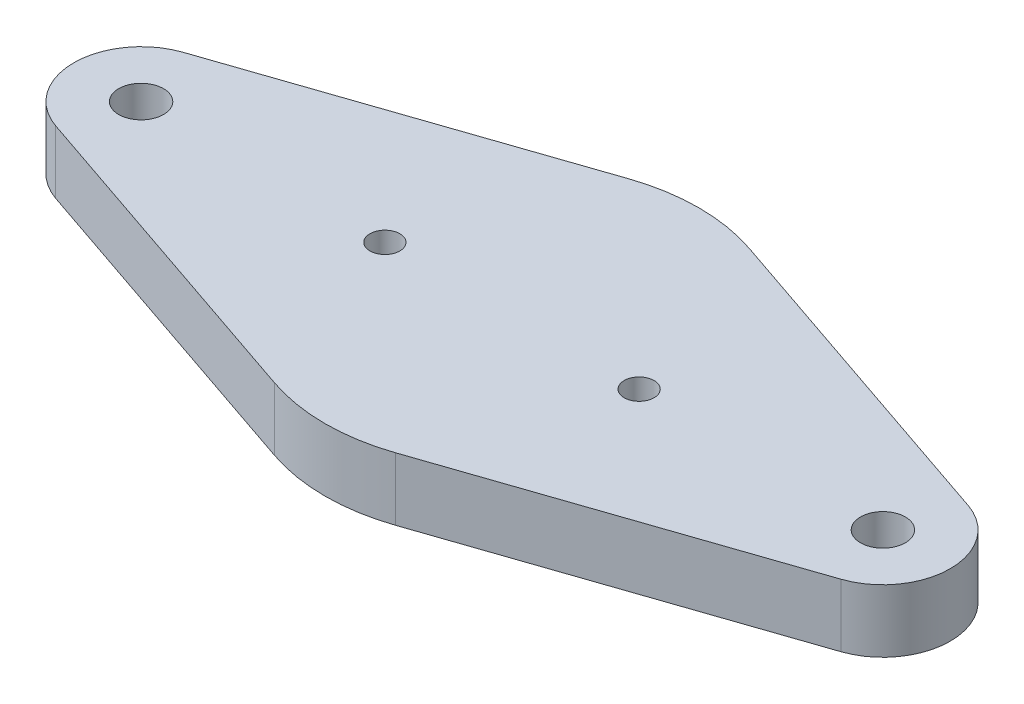
ISO-10303-21;
HEADER;
FILE_DESCRIPTION(('STEP AP214'),'2;1');
FILE_NAME('part.step','',(''),(''),'','','');
FILE_SCHEMA(('AUTOMOTIVE_DESIGN { 1 0 10303 214 1 1 1 1 }'));
ENDSEC;
DATA;
#1=APPLICATION_CONTEXT('core data for automotive mechanical design processes');
#2=APPLICATION_PROTOCOL_DEFINITION('international standard','automotive_design',2000,#1);
#3=PRODUCT_CONTEXT('',#1,'mechanical');
#4=PRODUCT('Part','Part','',(#3));
#5=PRODUCT_RELATED_PRODUCT_CATEGORY('part','',(#4));
#6=PRODUCT_DEFINITION_FORMATION('','',#4);
#7=PRODUCT_DEFINITION_CONTEXT('part definition',#1,'design');
#8=PRODUCT_DEFINITION('design','',#6,#7);
#9=PRODUCT_DEFINITION_SHAPE('','',#8);
#10=(LENGTH_UNIT() NAMED_UNIT(*) SI_UNIT(.MILLI.,.METRE.));
#11=(NAMED_UNIT(*) PLANE_ANGLE_UNIT() SI_UNIT($,.RADIAN.));
#12=(NAMED_UNIT(*) SI_UNIT($,.STERADIAN.) SOLID_ANGLE_UNIT());
#13=UNCERTAINTY_MEASURE_WITH_UNIT(LENGTH_MEASURE(1.E-05),#10,'distance_accuracy_value','');
#14=(GEOMETRIC_REPRESENTATION_CONTEXT(3) GLOBAL_UNCERTAINTY_ASSIGNED_CONTEXT((#13)) GLOBAL_UNIT_ASSIGNED_CONTEXT((#10,
#11,#12)) REPRESENTATION_CONTEXT('',''));
#15=CARTESIAN_POINT('',(0.,0.,0.));
#16=DIRECTION('',(0.,0.,1.));
#17=DIRECTION('',(1.,0.,0.));
#18=AXIS2_PLACEMENT_3D('',#15,#16,#17);
#19=CARTESIAN_POINT('',(24.8,4.2,0.));
#20=DIRECTION('',(0.,1.,0.));
#21=DIRECTION('',(0.,0.,1.));
#22=AXIS2_PLACEMENT_3D('',#19,#20,#21);
#23=PLANE('',#22);
#24=CARTESIAN_POINT('',(8.5,4.2,0.));
#25=DIRECTION('',(0.,1.,0.));
#26=DIRECTION('',(0.,0.,1.));
#27=AXIS2_PLACEMENT_3D('',#24,#25,#26);
#28=CIRCLE('',#27,1.);
#29=CARTESIAN_POINT('',(8.5,4.2,1.));
#30=VERTEX_POINT('',#29);
#31=EDGE_CURVE('E192',#30,#30,#28,.T.);
#32=ORIENTED_EDGE('',*,*,#31,.F.);
#33=EDGE_LOOP('',(#32));
#34=FACE_BOUND('',#33,.T.);
#35=CARTESIAN_POINT('',(24.8,4.2,0.));
#36=DIRECTION('',(0.,1.,0.));
#37=DIRECTION('',(0.,0.,1.));
#38=AXIS2_PLACEMENT_3D('',#35,#36,#37);
#39=CIRCLE('',#38,1.5);
#40=CARTESIAN_POINT('',(24.8,4.2,1.5));
#41=VERTEX_POINT('',#40);
#42=EDGE_CURVE('E138',#41,#41,#39,.T.);
#43=ORIENTED_EDGE('',*,*,#42,.F.);
#44=EDGE_LOOP('',(#43));
#45=FACE_BOUND('',#44,.T.);
#46=CARTESIAN_POINT('',(24.8,4.2,0.));
#47=DIRECTION('',(0.,1.,0.));
#48=DIRECTION('',(0.,0.,1.));
#49=AXIS2_PLACEMENT_3D('',#46,#47,#48);
#50=CIRCLE('',#49,4.5);
#51=CARTESIAN_POINT('',(26.2516129032258,4.2,4.25943892774487));
#52=VERTEX_POINT('',#51);
#53=CARTESIAN_POINT('',(26.2516129032258,4.2,-4.25943892774487));
#54=VERTEX_POINT('',#53);
#55=EDGE_CURVE('E149',#52,#54,#50,.T.);
#56=ORIENTED_EDGE('',*,*,#55,.T.);
#57=DIRECTION('',(-0.946541983943304,0.,-0.32258064516129));
#58=VECTOR('',#57,1.);
#59=CARTESIAN_POINT('',(26.2516129032258,4.2,-4.25943892774487));
#60=LINE('',#59,#58);
#61=CARTESIAN_POINT('',(4.03225806451613,4.2,-11.8317747992913));
#62=VERTEX_POINT('',#61);
#63=EDGE_CURVE('E97',#54,#62,#60,.T.);
#64=ORIENTED_EDGE('',*,*,#63,.T.);
#65=CARTESIAN_POINT('',(0.,4.2,0.));
#66=DIRECTION('',(0.,1.,0.));
#67=DIRECTION('',(0.,0.,1.));
#68=AXIS2_PLACEMENT_3D('',#65,#66,#67);
#69=CIRCLE('',#68,12.5);
#70=CARTESIAN_POINT('',(-4.03225806451613,4.2,-11.8317747992913));
#71=VERTEX_POINT('',#70);
#72=EDGE_CURVE('E164',#62,#71,#69,.T.);
#73=ORIENTED_EDGE('',*,*,#72,.T.);
#74=DIRECTION('',(-0.946541983943304,0.,0.32258064516129));
#75=VECTOR('',#74,1.);
#76=CARTESIAN_POINT('',(-4.03225806451613,4.2,-11.8317747992913));
#77=LINE('',#76,#75);
#78=CARTESIAN_POINT('',(-26.2516129032258,4.2,-4.25943892774487));
#79=VERTEX_POINT('',#78);
#80=EDGE_CURVE('E177',#71,#79,#77,.T.);
#81=ORIENTED_EDGE('',*,*,#80,.T.);
#82=CARTESIAN_POINT('',(-24.8,4.2,0.));
#83=DIRECTION('',(0.,1.,0.));
#84=DIRECTION('',(0.,0.,1.));
#85=AXIS2_PLACEMENT_3D('',#82,#83,#84);
#86=CIRCLE('',#85,4.5);
#87=CARTESIAN_POINT('',(-26.2516129032258,4.2,4.25943892774486));
#88=VERTEX_POINT('',#87);
#89=EDGE_CURVE('E116',#79,#88,#86,.T.);
#90=ORIENTED_EDGE('',*,*,#89,.T.);
#91=DIRECTION('',(0.946541983943304,0.,0.32258064516129));
#92=VECTOR('',#91,1.);
#93=CARTESIAN_POINT('',(-4.03225806451613,4.2,11.8317747992913));
#94=LINE('',#93,#92);
#95=CARTESIAN_POINT('',(-4.03225806451613,4.2,11.8317747992913));
#96=VERTEX_POINT('',#95);
#97=EDGE_CURVE('E110',#88,#96,#94,.T.);
#98=ORIENTED_EDGE('',*,*,#97,.T.);
#99=CARTESIAN_POINT('',(0.,4.2,0.));
#100=DIRECTION('',(0.,1.,0.));
#101=DIRECTION('',(0.,0.,1.));
#102=AXIS2_PLACEMENT_3D('',#99,#100,#101);
#103=CIRCLE('',#102,12.5);
#104=CARTESIAN_POINT('',(4.03225806451613,4.2,11.8317747992913));
#105=VERTEX_POINT('',#104);
#106=EDGE_CURVE('E114',#96,#105,#103,.T.);
#107=ORIENTED_EDGE('',*,*,#106,.T.);
#108=DIRECTION('',(0.946541983943304,0.,-0.32258064516129));
#109=VECTOR('',#108,1.);
#110=CARTESIAN_POINT('',(26.2516129032258,4.2,4.25943892774487));
#111=LINE('',#110,#109);
#112=EDGE_CURVE('E54',#105,#52,#111,.T.);
#113=ORIENTED_EDGE('',*,*,#112,.T.);
#114=EDGE_LOOP('',(#56,#64,#73,#81,#90,#98,#107,#113));
#115=FACE_BOUND('',#114,.T.);
#116=CARTESIAN_POINT('',(-24.8,4.2,0.));
#117=DIRECTION('',(0.,1.,0.));
#118=DIRECTION('',(0.,0.,1.));
#119=AXIS2_PLACEMENT_3D('',#116,#117,#118);
#120=CIRCLE('',#119,1.5);
#121=CARTESIAN_POINT('',(-24.8,4.2,1.5));
#122=VERTEX_POINT('',#121);
#123=EDGE_CURVE('E186',#122,#122,#120,.T.);
#124=ORIENTED_EDGE('',*,*,#123,.F.);
#125=EDGE_LOOP('',(#124));
#126=FACE_BOUND('',#125,.T.);
#127=CARTESIAN_POINT('',(-8.5,4.2,0.));
#128=DIRECTION('',(0.,1.,0.));
#129=DIRECTION('',(0.,0.,1.));
#130=AXIS2_PLACEMENT_3D('',#127,#128,#129);
#131=CIRCLE('',#130,1.);
#132=CARTESIAN_POINT('',(-8.5,4.2,1.));
#133=VERTEX_POINT('',#132);
#134=EDGE_CURVE('E198',#133,#133,#131,.T.);
#135=ORIENTED_EDGE('',*,*,#134,.F.);
#136=EDGE_LOOP('',(#135));
#137=FACE_BOUND('',#136,.T.);
#138=ADVANCED_FACE('F37',(#34,#45,#115,#126,#137),#23,.T.);
#139=CARTESIAN_POINT('',(24.8,0.,0.));
#140=DIRECTION('',(0.,1.,0.));
#141=DIRECTION('',(0.,0.,1.));
#142=AXIS2_PLACEMENT_3D('',#139,#140,#141);
#143=PLANE('',#142);
#144=CARTESIAN_POINT('',(8.5,0.,0.));
#145=DIRECTION('',(0.,1.,0.));
#146=DIRECTION('',(0.,0.,1.));
#147=AXIS2_PLACEMENT_3D('',#144,#145,#146);
#148=CIRCLE('',#147,1.);
#149=CARTESIAN_POINT('',(8.5,0.,1.));
#150=VERTEX_POINT('',#149);
#151=EDGE_CURVE('E195',#150,#150,#148,.T.);
#152=ORIENTED_EDGE('',*,*,#151,.T.);
#153=EDGE_LOOP('',(#152));
#154=FACE_BOUND('',#153,.T.);
#155=CARTESIAN_POINT('',(24.8,0.,0.));
#156=DIRECTION('',(0.,1.,0.));
#157=DIRECTION('',(0.,0.,1.));
#158=AXIS2_PLACEMENT_3D('',#155,#156,#157);
#159=CIRCLE('',#158,1.5);
#160=CARTESIAN_POINT('',(24.8,0.,1.5));
#161=VERTEX_POINT('',#160);
#162=EDGE_CURVE('E183',#161,#161,#159,.T.);
#163=ORIENTED_EDGE('',*,*,#162,.T.);
#164=EDGE_LOOP('',(#163));
#165=FACE_BOUND('',#164,.T.);
#166=CARTESIAN_POINT('',(24.8,0.,0.));
#167=DIRECTION('',(0.,1.,0.));
#168=DIRECTION('',(0.,0.,1.));
#169=AXIS2_PLACEMENT_3D('',#166,#167,#168);
#170=CIRCLE('',#169,4.5);
#171=CARTESIAN_POINT('',(26.2516129032258,0.,4.25943892774487));
#172=VERTEX_POINT('',#171);
#173=CARTESIAN_POINT('',(26.2516129032258,0.,-4.25943892774487));
#174=VERTEX_POINT('',#173);
#175=EDGE_CURVE('E134',#172,#174,#170,.T.);
#176=ORIENTED_EDGE('',*,*,#175,.F.);
#177=DIRECTION('',(0.946541983943304,0.,-0.32258064516129));
#178=VECTOR('',#177,1.);
#179=CARTESIAN_POINT('',(26.2516129032258,0.,4.25943892774487));
#180=LINE('',#179,#178);
#181=CARTESIAN_POINT('',(4.03225806451613,0.,11.8317747992913));
#182=VERTEX_POINT('',#181);
#183=EDGE_CURVE('E89',#182,#172,#180,.T.);
#184=ORIENTED_EDGE('',*,*,#183,.F.);
#185=CARTESIAN_POINT('',(0.,0.,0.));
#186=DIRECTION('',(0.,1.,0.));
#187=DIRECTION('',(0.,0.,1.));
#188=AXIS2_PLACEMENT_3D('',#185,#186,#187);
#189=CIRCLE('',#188,12.5);
#190=CARTESIAN_POINT('',(-4.03225806451613,0.,11.8317747992913));
#191=VERTEX_POINT('',#190);
#192=EDGE_CURVE('E83',#191,#182,#189,.T.);
#193=ORIENTED_EDGE('',*,*,#192,.F.);
#194=DIRECTION('',(0.946541983943304,0.,0.32258064516129));
#195=VECTOR('',#194,1.);
#196=CARTESIAN_POINT('',(-4.03225806451613,0.,11.8317747992913));
#197=LINE('',#196,#195);
#198=CARTESIAN_POINT('',(-26.2516129032258,0.,4.25943892774486));
#199=VERTEX_POINT('',#198);
#200=EDGE_CURVE('E124',#199,#191,#197,.T.);
#201=ORIENTED_EDGE('',*,*,#200,.F.);
#202=CARTESIAN_POINT('',(-24.8,0.,0.));
#203=DIRECTION('',(0.,1.,0.));
#204=DIRECTION('',(0.,0.,1.));
#205=AXIS2_PLACEMENT_3D('',#202,#203,#204);
#206=CIRCLE('',#205,4.5);
#207=CARTESIAN_POINT('',(-26.2516129032258,0.,-4.25943892774487));
#208=VERTEX_POINT('',#207);
#209=EDGE_CURVE('E144',#208,#199,#206,.T.);
#210=ORIENTED_EDGE('',*,*,#209,.F.);
#211=DIRECTION('',(-0.946541983943304,0.,0.32258064516129));
#212=VECTOR('',#211,1.);
#213=CARTESIAN_POINT('',(-4.03225806451613,0.,-11.8317747992913));
#214=LINE('',#213,#212);
#215=CARTESIAN_POINT('',(-4.03225806451613,0.,-11.8317747992913));
#216=VERTEX_POINT('',#215);
#217=EDGE_CURVE('E142',#216,#208,#214,.T.);
#218=ORIENTED_EDGE('',*,*,#217,.F.);
#219=CARTESIAN_POINT('',(0.,0.,0.));
#220=DIRECTION('',(0.,1.,0.));
#221=DIRECTION('',(0.,0.,1.));
#222=AXIS2_PLACEMENT_3D('',#219,#220,#221);
#223=CIRCLE('',#222,12.5);
#224=CARTESIAN_POINT('',(4.03225806451613,0.,-11.8317747992913));
#225=VERTEX_POINT('',#224);
#226=EDGE_CURVE('E140',#225,#216,#223,.T.);
#227=ORIENTED_EDGE('',*,*,#226,.F.);
#228=DIRECTION('',(-0.946541983943304,0.,-0.32258064516129));
#229=VECTOR('',#228,1.);
#230=CARTESIAN_POINT('',(26.2516129032258,0.,-4.25943892774487));
#231=LINE('',#230,#229);
#232=EDGE_CURVE('E137',#174,#225,#231,.T.);
#233=ORIENTED_EDGE('',*,*,#232,.F.);
#234=EDGE_LOOP('',(#176,#184,#193,#201,#210,#218,#227,#233));
#235=FACE_BOUND('',#234,.T.);
#236=CARTESIAN_POINT('',(-24.8,0.,0.));
#237=DIRECTION('',(0.,1.,0.));
#238=DIRECTION('',(0.,0.,1.));
#239=AXIS2_PLACEMENT_3D('',#236,#237,#238);
#240=CIRCLE('',#239,1.5);
#241=CARTESIAN_POINT('',(-24.8,0.,1.5));
#242=VERTEX_POINT('',#241);
#243=EDGE_CURVE('E189',#242,#242,#240,.T.);
#244=ORIENTED_EDGE('',*,*,#243,.T.);
#245=EDGE_LOOP('',(#244));
#246=FACE_BOUND('',#245,.T.);
#247=CARTESIAN_POINT('',(-8.5,0.,0.));
#248=DIRECTION('',(0.,1.,0.));
#249=DIRECTION('',(0.,0.,1.));
#250=AXIS2_PLACEMENT_3D('',#247,#248,#249);
#251=CIRCLE('',#250,1.);
#252=CARTESIAN_POINT('',(-8.5,0.,1.));
#253=VERTEX_POINT('',#252);
#254=EDGE_CURVE('E201',#253,#253,#251,.T.);
#255=ORIENTED_EDGE('',*,*,#254,.T.);
#256=EDGE_LOOP('',(#255));
#257=FACE_BOUND('',#256,.T.);
#258=ADVANCED_FACE('F168',(#154,#165,#235,#246,#257),#143,.F.);
#259=CARTESIAN_POINT('',(24.8,4.2,0.));
#260=DIRECTION('',(0.,-1.,0.));
#261=DIRECTION('',(0.,0.,-1.));
#262=AXIS2_PLACEMENT_3D('',#259,#260,#261);
#263=CYLINDRICAL_SURFACE('',#262,4.5);
#264=ORIENTED_EDGE('',*,*,#175,.T.);
#265=DIRECTION('',(0.,-1.,0.));
#266=VECTOR('',#265,1.);
#267=CARTESIAN_POINT('',(26.2516129032258,4.2,-4.25943892774487));
#268=LINE('',#267,#266);
#269=EDGE_CURVE('E11',#54,#174,#268,.T.);
#270=ORIENTED_EDGE('',*,*,#269,.F.);
#271=ORIENTED_EDGE('',*,*,#55,.F.);
#272=DIRECTION('',(0.,-1.,0.));
#273=VECTOR('',#272,1.);
#274=CARTESIAN_POINT('',(26.2516129032258,4.2,4.25943892774487));
#275=LINE('',#274,#273);
#276=EDGE_CURVE('E130',#52,#172,#275,.T.);
#277=ORIENTED_EDGE('',*,*,#276,.T.);
#278=EDGE_LOOP('',(#264,#270,#271,#277));
#279=FACE_BOUND('',#278,.T.);
#280=ADVANCED_FACE('F39',(#279),#263,.T.);
#281=CARTESIAN_POINT('',(26.2516129032258,4.2,-4.25943892774487));
#282=DIRECTION('',(-0.32258064516129,0.,0.946541983943304));
#283=DIRECTION('',(0.946541983943304,0.,0.32258064516129));
#284=AXIS2_PLACEMENT_3D('',#281,#282,#283);
#285=PLANE('',#284);
#286=ORIENTED_EDGE('',*,*,#232,.T.);
#287=DIRECTION('',(0.,-1.,0.));
#288=VECTOR('',#287,1.);
#289=CARTESIAN_POINT('',(4.03225806451613,4.2,-11.8317747992913));
#290=LINE('',#289,#288);
#291=EDGE_CURVE('E46',#62,#225,#290,.T.);
#292=ORIENTED_EDGE('',*,*,#291,.F.);
#293=ORIENTED_EDGE('',*,*,#63,.F.);
#294=ORIENTED_EDGE('',*,*,#269,.T.);
#295=EDGE_LOOP('',(#286,#292,#293,#294));
#296=FACE_BOUND('',#295,.T.);
#297=ADVANCED_FACE('F236',(#296),#285,.F.);
#298=CARTESIAN_POINT('',(0.,4.2,0.));
#299=DIRECTION('',(0.,-1.,0.));
#300=DIRECTION('',(0.,0.,-1.));
#301=AXIS2_PLACEMENT_3D('',#298,#299,#300);
#302=CYLINDRICAL_SURFACE('',#301,12.5);
#303=ORIENTED_EDGE('',*,*,#226,.T.);
#304=DIRECTION('',(0.,-1.,0.));
#305=VECTOR('',#304,1.);
#306=CARTESIAN_POINT('',(-4.03225806451613,4.2,-11.8317747992913));
#307=LINE('',#306,#305);
#308=EDGE_CURVE('E156',#71,#216,#307,.T.);
#309=ORIENTED_EDGE('',*,*,#308,.F.);
#310=ORIENTED_EDGE('',*,*,#72,.F.);
#311=ORIENTED_EDGE('',*,*,#291,.T.);
#312=EDGE_LOOP('',(#303,#309,#310,#311));
#313=FACE_BOUND('',#312,.T.);
#314=ADVANCED_FACE('F162',(#313),#302,.T.);
#315=CARTESIAN_POINT('',(-4.03225806451613,4.2,-11.8317747992913));
#316=DIRECTION('',(0.32258064516129,0.,0.946541983943304));
#317=DIRECTION('',(0.946541983943304,0.,-0.32258064516129));
#318=AXIS2_PLACEMENT_3D('',#315,#316,#317);
#319=PLANE('',#318);
#320=ORIENTED_EDGE('',*,*,#217,.T.);
#321=DIRECTION('',(0.,-1.,0.));
#322=VECTOR('',#321,1.);
#323=CARTESIAN_POINT('',(-26.2516129032258,4.2,-4.25943892774487));
#324=LINE('',#323,#322);
#325=EDGE_CURVE('E153',#79,#208,#324,.T.);
#326=ORIENTED_EDGE('',*,*,#325,.F.);
#327=ORIENTED_EDGE('',*,*,#80,.F.);
#328=ORIENTED_EDGE('',*,*,#308,.T.);
#329=EDGE_LOOP('',(#320,#326,#327,#328));
#330=FACE_BOUND('',#329,.T.);
#331=ADVANCED_FACE('F173',(#330),#319,.F.);
#332=CARTESIAN_POINT('',(-24.8,4.2,0.));
#333=DIRECTION('',(0.,-1.,0.));
#334=DIRECTION('',(0.,0.,-1.));
#335=AXIS2_PLACEMENT_3D('',#332,#333,#334);
#336=CYLINDRICAL_SURFACE('',#335,4.5);
#337=ORIENTED_EDGE('',*,*,#209,.T.);
#338=DIRECTION('',(0.,-1.,0.));
#339=VECTOR('',#338,1.);
#340=CARTESIAN_POINT('',(-26.2516129032258,4.2,4.25943892774486));
#341=LINE('',#340,#339);
#342=EDGE_CURVE('E125',#88,#199,#341,.T.);
#343=ORIENTED_EDGE('',*,*,#342,.F.);
#344=ORIENTED_EDGE('',*,*,#89,.F.);
#345=ORIENTED_EDGE('',*,*,#325,.T.);
#346=EDGE_LOOP('',(#337,#343,#344,#345));
#347=FACE_BOUND('',#346,.T.);
#348=ADVANCED_FACE('F176',(#347),#336,.T.);
#349=CARTESIAN_POINT('',(-4.03225806451613,4.2,11.8317747992913));
#350=DIRECTION('',(0.32258064516129,0.,-0.946541983943304));
#351=DIRECTION('',(-0.946541983943304,0.,-0.32258064516129));
#352=AXIS2_PLACEMENT_3D('',#349,#350,#351);
#353=PLANE('',#352);
#354=ORIENTED_EDGE('',*,*,#200,.T.);
#355=DIRECTION('',(0.,-1.,0.));
#356=VECTOR('',#355,1.);
#357=CARTESIAN_POINT('',(-4.03225806451613,4.2,11.8317747992913));
#358=LINE('',#357,#356);
#359=EDGE_CURVE('E121',#96,#191,#358,.T.);
#360=ORIENTED_EDGE('',*,*,#359,.F.);
#361=ORIENTED_EDGE('',*,*,#97,.F.);
#362=ORIENTED_EDGE('',*,*,#342,.T.);
#363=EDGE_LOOP('',(#354,#360,#361,#362));
#364=FACE_BOUND('',#363,.T.);
#365=ADVANCED_FACE('F122',(#364),#353,.F.);
#366=CARTESIAN_POINT('',(0.,4.2,0.));
#367=DIRECTION('',(0.,-1.,0.));
#368=DIRECTION('',(0.,0.,-1.));
#369=AXIS2_PLACEMENT_3D('',#366,#367,#368);
#370=CYLINDRICAL_SURFACE('',#369,12.5);
#371=ORIENTED_EDGE('',*,*,#192,.T.);
#372=DIRECTION('',(0.,-1.,0.));
#373=VECTOR('',#372,1.);
#374=CARTESIAN_POINT('',(4.03225806451613,4.2,11.8317747992913));
#375=LINE('',#374,#373);
#376=EDGE_CURVE('E126',#105,#182,#375,.T.);
#377=ORIENTED_EDGE('',*,*,#376,.F.);
#378=ORIENTED_EDGE('',*,*,#106,.F.);
#379=ORIENTED_EDGE('',*,*,#359,.T.);
#380=EDGE_LOOP('',(#371,#377,#378,#379));
#381=FACE_BOUND('',#380,.T.);
#382=ADVANCED_FACE('F128',(#381),#370,.T.);
#383=CARTESIAN_POINT('',(26.2516129032258,4.2,4.25943892774487));
#384=DIRECTION('',(-0.32258064516129,0.,-0.946541983943304));
#385=DIRECTION('',(-0.946541983943304,0.,0.32258064516129));
#386=AXIS2_PLACEMENT_3D('',#383,#384,#385);
#387=PLANE('',#386);
#388=ORIENTED_EDGE('',*,*,#183,.T.);
#389=ORIENTED_EDGE('',*,*,#276,.F.);
#390=ORIENTED_EDGE('',*,*,#112,.F.);
#391=ORIENTED_EDGE('',*,*,#376,.T.);
#392=EDGE_LOOP('',(#388,#389,#390,#391));
#393=FACE_BOUND('',#392,.T.);
#394=ADVANCED_FACE('F224',(#393),#387,.F.);
#395=CARTESIAN_POINT('',(24.8,4.2,0.));
#396=DIRECTION('',(0.,-1.,0.));
#397=DIRECTION('',(0.,0.,-1.));
#398=AXIS2_PLACEMENT_3D('',#395,#396,#397);
#399=CYLINDRICAL_SURFACE('',#398,1.5);
#400=ORIENTED_EDGE('',*,*,#42,.T.);
#401=EDGE_LOOP('',(#400));
#402=FACE_BOUND('',#401,.T.);
#403=ORIENTED_EDGE('',*,*,#162,.F.);
#404=EDGE_LOOP('',(#403));
#405=FACE_BOUND('',#404,.T.);
#406=ADVANCED_FACE('F221',(#402,#405),#399,.F.);
#407=CARTESIAN_POINT('',(-24.8,4.2,0.));
#408=DIRECTION('',(0.,-1.,0.));
#409=DIRECTION('',(0.,0.,-1.));
#410=AXIS2_PLACEMENT_3D('',#407,#408,#409);
#411=CYLINDRICAL_SURFACE('',#410,1.5);
#412=ORIENTED_EDGE('',*,*,#123,.T.);
#413=EDGE_LOOP('',(#412));
#414=FACE_BOUND('',#413,.T.);
#415=ORIENTED_EDGE('',*,*,#243,.F.);
#416=EDGE_LOOP('',(#415));
#417=FACE_BOUND('',#416,.T.);
#418=ADVANCED_FACE('F300',(#414,#417),#411,.F.);
#419=CARTESIAN_POINT('',(8.5,4.2,0.));
#420=DIRECTION('',(0.,-1.,0.));
#421=DIRECTION('',(0.,0.,-1.));
#422=AXIS2_PLACEMENT_3D('',#419,#420,#421);
#423=CYLINDRICAL_SURFACE('',#422,1.);
#424=ORIENTED_EDGE('',*,*,#31,.T.);
#425=EDGE_LOOP('',(#424));
#426=FACE_BOUND('',#425,.T.);
#427=ORIENTED_EDGE('',*,*,#151,.F.);
#428=EDGE_LOOP('',(#427));
#429=FACE_BOUND('',#428,.T.);
#430=ADVANCED_FACE('F308',(#426,#429),#423,.F.);
#431=CARTESIAN_POINT('',(-8.5,4.2,0.));
#432=DIRECTION('',(0.,-1.,0.));
#433=DIRECTION('',(0.,0.,-1.));
#434=AXIS2_PLACEMENT_3D('',#431,#432,#433);
#435=CYLINDRICAL_SURFACE('',#434,1.);
#436=ORIENTED_EDGE('',*,*,#134,.T.);
#437=EDGE_LOOP('',(#436));
#438=FACE_BOUND('',#437,.T.);
#439=ORIENTED_EDGE('',*,*,#254,.F.);
#440=EDGE_LOOP('',(#439));
#441=FACE_BOUND('',#440,.T.);
#442=ADVANCED_FACE('F207',(#438,#441),#435,.F.);
#443=CLOSED_SHELL('',(#138,#258,#280,#297,#314,#331,#348,#365,#382,#394,#406,#418,#430,#442));
#444=MANIFOLD_SOLID_BREP('B2',#443);
#445=ADVANCED_BREP_SHAPE_REPRESENTATION('',(#18,#444),#14);
#446=SHAPE_DEFINITION_REPRESENTATION(#9,#445);
ENDSEC;
END-ISO-10303-21;
